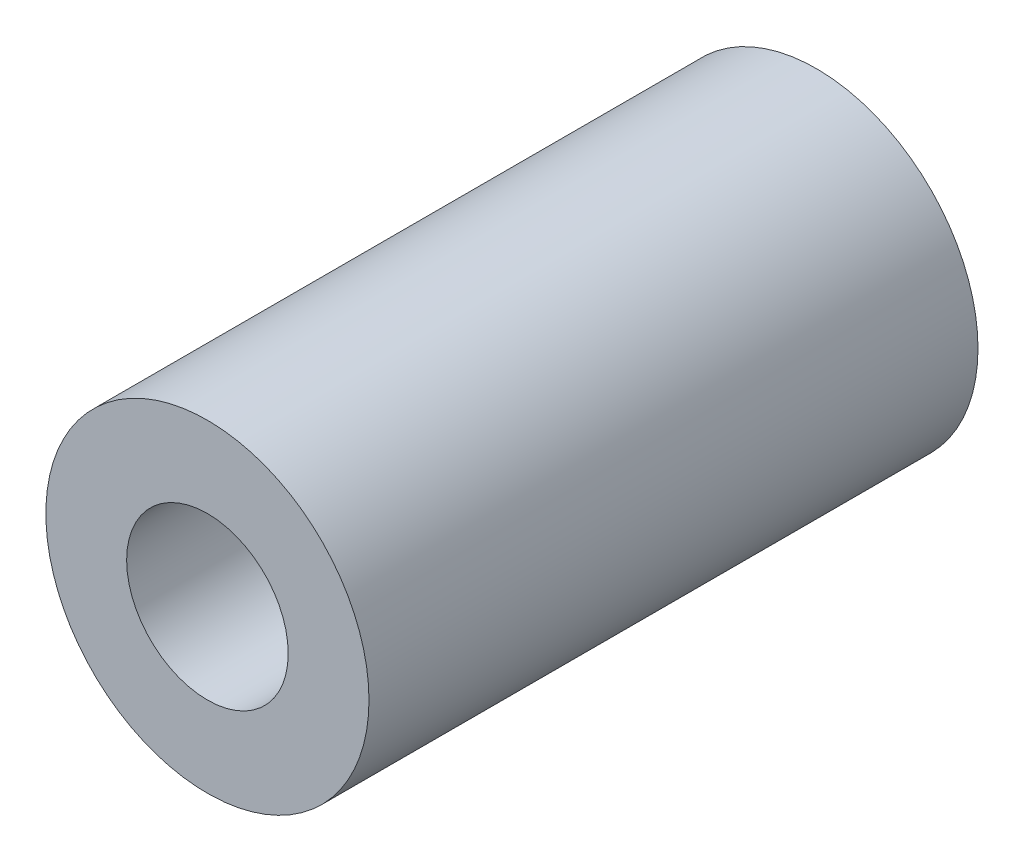
ISO-10303-21;
HEADER;
FILE_DESCRIPTION(('STEP AP214'),'2;1');
FILE_NAME('part.step','',(''),(''),'','','');
FILE_SCHEMA(('AUTOMOTIVE_DESIGN { 1 0 10303 214 1 1 1 1 }'));
ENDSEC;
DATA;
#1=APPLICATION_CONTEXT('core data for automotive mechanical design processes');
#2=APPLICATION_PROTOCOL_DEFINITION('international standard','automotive_design',2000,#1);
#3=PRODUCT_CONTEXT('',#1,'mechanical');
#4=PRODUCT('Part','Part','',(#3));
#5=PRODUCT_RELATED_PRODUCT_CATEGORY('part','',(#4));
#6=PRODUCT_DEFINITION_FORMATION('','',#4);
#7=PRODUCT_DEFINITION_CONTEXT('part definition',#1,'design');
#8=PRODUCT_DEFINITION('design','',#6,#7);
#9=PRODUCT_DEFINITION_SHAPE('','',#8);
#10=(LENGTH_UNIT() NAMED_UNIT(*) SI_UNIT(.MILLI.,.METRE.));
#11=(NAMED_UNIT(*) PLANE_ANGLE_UNIT() SI_UNIT($,.RADIAN.));
#12=(NAMED_UNIT(*) SI_UNIT($,.STERADIAN.) SOLID_ANGLE_UNIT());
#13=UNCERTAINTY_MEASURE_WITH_UNIT(LENGTH_MEASURE(1.E-05),#10,'distance_accuracy_value','');
#14=(GEOMETRIC_REPRESENTATION_CONTEXT(3) GLOBAL_UNCERTAINTY_ASSIGNED_CONTEXT((#13)) GLOBAL_UNIT_ASSIGNED_CONTEXT((#10,
#11,#12)) REPRESENTATION_CONTEXT('',''));
#15=CARTESIAN_POINT('',(0.,0.,0.));
#16=DIRECTION('',(0.,0.,1.));
#17=DIRECTION('',(1.,0.,0.));
#18=AXIS2_PLACEMENT_3D('',#15,#16,#17);
#19=CARTESIAN_POINT('',(0.,0.,49.));
#20=DIRECTION('',(0.,0.,1.));
#21=DIRECTION('',(1.,0.,0.));
#22=AXIS2_PLACEMENT_3D('',#19,#20,#21);
#23=PLANE('',#22);
#24=CARTESIAN_POINT('',(0.,0.,49.));
#25=DIRECTION('',(0.,0.,1.));
#26=DIRECTION('',(1.,0.,0.));
#27=AXIS2_PLACEMENT_3D('',#24,#25,#26);
#28=CIRCLE('',#27,13.);
#29=CARTESIAN_POINT('',(13.,0.,49.));
#30=VERTEX_POINT('',#29);
#31=EDGE_CURVE('E10',#30,#30,#28,.T.);
#32=ORIENTED_EDGE('',*,*,#31,.T.);
#33=EDGE_LOOP('',(#32));
#34=FACE_BOUND('',#33,.T.);
#35=CARTESIAN_POINT('',(0.,0.,49.));
#36=DIRECTION('',(0.,0.,1.));
#37=DIRECTION('',(1.,0.,0.));
#38=AXIS2_PLACEMENT_3D('',#35,#36,#37);
#39=CIRCLE('',#38,6.5);
#40=CARTESIAN_POINT('',(6.5,0.,49.));
#41=VERTEX_POINT('',#40);
#42=EDGE_CURVE('E41',#41,#41,#39,.T.);
#43=ORIENTED_EDGE('',*,*,#42,.F.);
#44=EDGE_LOOP('',(#43));
#45=FACE_BOUND('',#44,.T.);
#46=ADVANCED_FACE('F30',(#34,#45),#23,.T.);
#47=CARTESIAN_POINT('',(0.,0.,0.));
#48=DIRECTION('',(0.,0.,1.));
#49=DIRECTION('',(1.,0.,0.));
#50=AXIS2_PLACEMENT_3D('',#47,#48,#49);
#51=PLANE('',#50);
#52=CARTESIAN_POINT('',(0.,0.,0.));
#53=DIRECTION('',(0.,0.,1.));
#54=DIRECTION('',(1.,0.,0.));
#55=AXIS2_PLACEMENT_3D('',#52,#53,#54);
#56=CIRCLE('',#55,13.);
#57=CARTESIAN_POINT('',(13.,0.,0.));
#58=VERTEX_POINT('',#57);
#59=EDGE_CURVE('E34',#58,#58,#56,.T.);
#60=ORIENTED_EDGE('',*,*,#59,.F.);
#61=EDGE_LOOP('',(#60));
#62=FACE_BOUND('',#61,.T.);
#63=CARTESIAN_POINT('',(0.,0.,0.));
#64=DIRECTION('',(0.,0.,1.));
#65=DIRECTION('',(1.,0.,0.));
#66=AXIS2_PLACEMENT_3D('',#63,#64,#65);
#67=CIRCLE('',#66,6.5);
#68=CARTESIAN_POINT('',(6.5,0.,0.));
#69=VERTEX_POINT('',#68);
#70=EDGE_CURVE('E43',#69,#69,#67,.T.);
#71=ORIENTED_EDGE('',*,*,#70,.T.);
#72=EDGE_LOOP('',(#71));
#73=FACE_BOUND('',#72,.T.);
#74=ADVANCED_FACE('F53',(#62,#73),#51,.F.);
#75=CARTESIAN_POINT('',(0.,0.,49.));
#76=DIRECTION('',(0.,0.,-1.));
#77=DIRECTION('',(-1.,0.,0.));
#78=AXIS2_PLACEMENT_3D('',#75,#76,#77);
#79=CYLINDRICAL_SURFACE('',#78,13.);
#80=ORIENTED_EDGE('',*,*,#31,.F.);
#81=EDGE_LOOP('',(#80));
#82=FACE_BOUND('',#81,.T.);
#83=ORIENTED_EDGE('',*,*,#59,.T.);
#84=EDGE_LOOP('',(#83));
#85=FACE_BOUND('',#84,.T.);
#86=ADVANCED_FACE('F32',(#82,#85),#79,.T.);
#87=CARTESIAN_POINT('',(0.,0.,49.));
#88=DIRECTION('',(0.,0.,-1.));
#89=DIRECTION('',(-1.,0.,0.));
#90=AXIS2_PLACEMENT_3D('',#87,#88,#89);
#91=CYLINDRICAL_SURFACE('',#90,6.5);
#92=ORIENTED_EDGE('',*,*,#42,.T.);
#93=EDGE_LOOP('',(#92));
#94=FACE_BOUND('',#93,.T.);
#95=ORIENTED_EDGE('',*,*,#70,.F.);
#96=EDGE_LOOP('',(#95));
#97=FACE_BOUND('',#96,.T.);
#98=ADVANCED_FACE('F49',(#94,#97),#91,.F.);
#99=CLOSED_SHELL('',(#46,#74,#86,#98));
#100=MANIFOLD_SOLID_BREP('B2',#99);
#101=ADVANCED_BREP_SHAPE_REPRESENTATION('',(#18,#100),#14);
#102=SHAPE_DEFINITION_REPRESENTATION(#9,#101);
ENDSEC;
END-ISO-10303-21;
